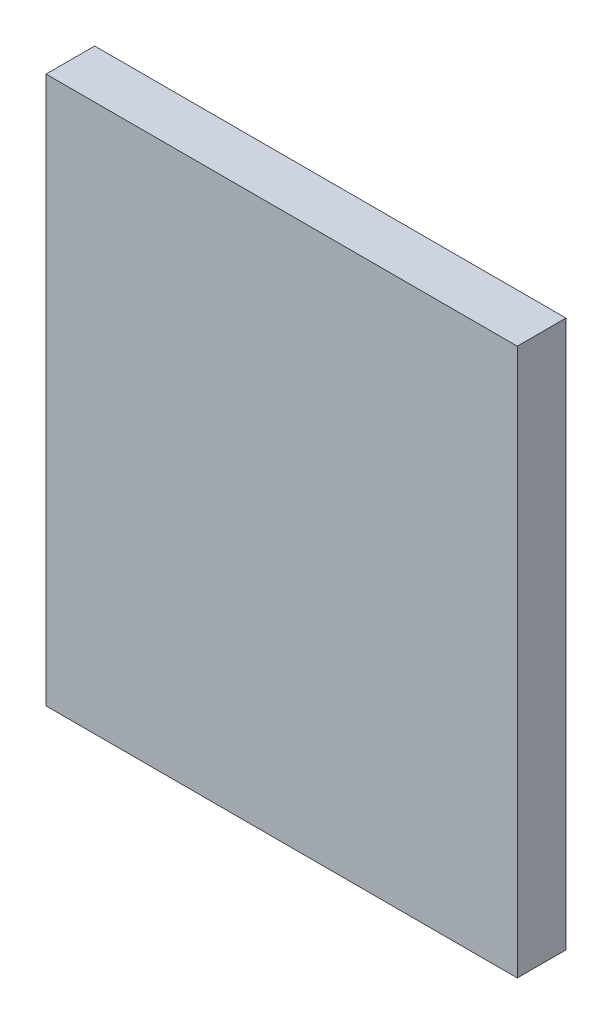
ISO-10303-21;
HEADER;
FILE_DESCRIPTION(('STEP AP214'),'2;1');
FILE_NAME('part.step','',(''),(''),'','','');
FILE_SCHEMA(('AUTOMOTIVE_DESIGN { 1 0 10303 214 1 1 1 1 }'));
ENDSEC;
DATA;
#1=APPLICATION_CONTEXT('core data for automotive mechanical design processes');
#2=APPLICATION_PROTOCOL_DEFINITION('international standard','automotive_design',2000,#1);
#3=PRODUCT_CONTEXT('',#1,'mechanical');
#4=PRODUCT('Part','Part','',(#3));
#5=PRODUCT_RELATED_PRODUCT_CATEGORY('part','',(#4));
#6=PRODUCT_DEFINITION_FORMATION('','',#4);
#7=PRODUCT_DEFINITION_CONTEXT('part definition',#1,'design');
#8=PRODUCT_DEFINITION('design','',#6,#7);
#9=PRODUCT_DEFINITION_SHAPE('','',#8);
#10=(LENGTH_UNIT() NAMED_UNIT(*) SI_UNIT(.MILLI.,.METRE.));
#11=(NAMED_UNIT(*) PLANE_ANGLE_UNIT() SI_UNIT($,.RADIAN.));
#12=(NAMED_UNIT(*) SI_UNIT($,.STERADIAN.) SOLID_ANGLE_UNIT());
#13=UNCERTAINTY_MEASURE_WITH_UNIT(LENGTH_MEASURE(1.E-05),#10,'distance_accuracy_value','');
#14=(GEOMETRIC_REPRESENTATION_CONTEXT(3) GLOBAL_UNCERTAINTY_ASSIGNED_CONTEXT((#13)) GLOBAL_UNIT_ASSIGNED_CONTEXT((#10,
#11,#12)) REPRESENTATION_CONTEXT('',''));
#15=CARTESIAN_POINT('',(0.,0.,0.));
#16=DIRECTION('',(0.,0.,1.));
#17=DIRECTION('',(1.,0.,0.));
#18=AXIS2_PLACEMENT_3D('',#15,#16,#17);
#19=CARTESIAN_POINT('',(0.,0.,1.2));
#20=DIRECTION('',(0.,0.,1.));
#21=DIRECTION('',(1.,0.,0.));
#22=AXIS2_PLACEMENT_3D('',#19,#20,#21);
#23=PLANE('',#22);
#24=DIRECTION('',(1.,0.,0.));
#25=VECTOR('',#24,1.);
#26=CARTESIAN_POINT('',(-5.8136,-6.75,1.2));
#27=LINE('',#26,#25);
#28=CARTESIAN_POINT('',(-5.8136,-6.75,1.2));
#29=VERTEX_POINT('',#28);
#30=CARTESIAN_POINT('',(5.8136,-6.75,1.2));
#31=VERTEX_POINT('',#30);
#32=EDGE_CURVE('E84',#29,#31,#27,.T.);
#33=ORIENTED_EDGE('',*,*,#32,.T.);
#34=DIRECTION('',(0.,1.,0.));
#35=VECTOR('',#34,1.);
#36=CARTESIAN_POINT('',(5.8136,-6.75,1.2));
#37=LINE('',#36,#35);
#38=CARTESIAN_POINT('',(5.8136,6.75,1.2));
#39=VERTEX_POINT('',#38);
#40=EDGE_CURVE('E53',#31,#39,#37,.T.);
#41=ORIENTED_EDGE('',*,*,#40,.T.);
#42=DIRECTION('',(-1.,0.,0.));
#43=VECTOR('',#42,1.);
#44=CARTESIAN_POINT('',(5.8136,6.75,1.2));
#45=LINE('',#44,#43);
#46=CARTESIAN_POINT('',(-5.8136,6.75,1.2));
#47=VERTEX_POINT('',#46);
#48=EDGE_CURVE('E75',#39,#47,#45,.T.);
#49=ORIENTED_EDGE('',*,*,#48,.T.);
#50=DIRECTION('',(0.,-1.,0.));
#51=VECTOR('',#50,1.);
#52=CARTESIAN_POINT('',(-5.8136,6.75,1.2));
#53=LINE('',#52,#51);
#54=EDGE_CURVE('E11',#47,#29,#53,.T.);
#55=ORIENTED_EDGE('',*,*,#54,.T.);
#56=EDGE_LOOP('',(#33,#41,#49,#55));
#57=FACE_BOUND('',#56,.T.);
#58=ADVANCED_FACE('F16',(#57),#23,.T.);
#59=CARTESIAN_POINT('',(0.,0.,0.));
#60=DIRECTION('',(0.,0.,1.));
#61=DIRECTION('',(1.,0.,0.));
#62=AXIS2_PLACEMENT_3D('',#59,#60,#61);
#63=PLANE('',#62);
#64=DIRECTION('',(1.,0.,0.));
#65=VECTOR('',#64,1.);
#66=CARTESIAN_POINT('',(-5.8136,-6.75,0.));
#67=LINE('',#66,#65);
#68=CARTESIAN_POINT('',(-5.8136,-6.75,0.));
#69=VERTEX_POINT('',#68);
#70=CARTESIAN_POINT('',(5.8136,-6.75,0.));
#71=VERTEX_POINT('',#70);
#72=EDGE_CURVE('E96',#69,#71,#67,.T.);
#73=ORIENTED_EDGE('',*,*,#72,.F.);
#74=DIRECTION('',(0.,-1.,0.));
#75=VECTOR('',#74,1.);
#76=CARTESIAN_POINT('',(-5.8136,6.75,0.));
#77=LINE('',#76,#75);
#78=CARTESIAN_POINT('',(-5.8136,6.75,0.));
#79=VERTEX_POINT('',#78);
#80=EDGE_CURVE('E26',#79,#69,#77,.T.);
#81=ORIENTED_EDGE('',*,*,#80,.F.);
#82=DIRECTION('',(-1.,0.,0.));
#83=VECTOR('',#82,1.);
#84=CARTESIAN_POINT('',(5.8136,6.75,0.));
#85=LINE('',#84,#83);
#86=CARTESIAN_POINT('',(5.8136,6.75,0.));
#87=VERTEX_POINT('',#86);
#88=EDGE_CURVE('E87',#87,#79,#85,.T.);
#89=ORIENTED_EDGE('',*,*,#88,.F.);
#90=DIRECTION('',(0.,1.,0.));
#91=VECTOR('',#90,1.);
#92=CARTESIAN_POINT('',(5.8136,-6.75,0.));
#93=LINE('',#92,#91);
#94=EDGE_CURVE('E67',#71,#87,#93,.T.);
#95=ORIENTED_EDGE('',*,*,#94,.F.);
#96=EDGE_LOOP('',(#73,#81,#89,#95));
#97=FACE_BOUND('',#96,.T.);
#98=ADVANCED_FACE('F116',(#97),#63,.F.);
#99=CARTESIAN_POINT('',(-5.8136,6.75,0.));
#100=DIRECTION('',(1.,0.,0.));
#101=DIRECTION('',(0.,1.,0.));
#102=AXIS2_PLACEMENT_3D('',#99,#100,#101);
#103=PLANE('',#102);
#104=DIRECTION('',(0.,0.,1.));
#105=VECTOR('',#104,1.);
#106=CARTESIAN_POINT('',(-5.8136,6.75,0.));
#107=LINE('',#106,#105);
#108=EDGE_CURVE('E79',#79,#47,#107,.T.);
#109=ORIENTED_EDGE('',*,*,#108,.F.);
#110=ORIENTED_EDGE('',*,*,#80,.T.);
#111=DIRECTION('',(0.,0.,1.));
#112=VECTOR('',#111,1.);
#113=CARTESIAN_POINT('',(-5.8136,-6.75,0.));
#114=LINE('',#113,#112);
#115=EDGE_CURVE('E100',#69,#29,#114,.T.);
#116=ORIENTED_EDGE('',*,*,#115,.T.);
#117=ORIENTED_EDGE('',*,*,#54,.F.);
#118=EDGE_LOOP('',(#109,#110,#116,#117));
#119=FACE_BOUND('',#118,.T.);
#120=ADVANCED_FACE('F114',(#119),#103,.F.);
#121=CARTESIAN_POINT('',(5.8136,6.75,0.));
#122=DIRECTION('',(0.,-1.,0.));
#123=DIRECTION('',(0.,0.,-1.));
#124=AXIS2_PLACEMENT_3D('',#121,#122,#123);
#125=PLANE('',#124);
#126=DIRECTION('',(0.,0.,1.));
#127=VECTOR('',#126,1.);
#128=CARTESIAN_POINT('',(5.8136,6.75,0.));
#129=LINE('',#128,#127);
#130=EDGE_CURVE('E78',#87,#39,#129,.T.);
#131=ORIENTED_EDGE('',*,*,#130,.F.);
#132=ORIENTED_EDGE('',*,*,#88,.T.);
#133=ORIENTED_EDGE('',*,*,#108,.T.);
#134=ORIENTED_EDGE('',*,*,#48,.F.);
#135=EDGE_LOOP('',(#131,#132,#133,#134));
#136=FACE_BOUND('',#135,.T.);
#137=ADVANCED_FACE('F76',(#136),#125,.F.);
#138=CARTESIAN_POINT('',(5.8136,-6.75,0.));
#139=DIRECTION('',(-1.,0.,0.));
#140=DIRECTION('',(0.,0.,1.));
#141=AXIS2_PLACEMENT_3D('',#138,#139,#140);
#142=PLANE('',#141);
#143=DIRECTION('',(0.,0.,1.));
#144=VECTOR('',#143,1.);
#145=CARTESIAN_POINT('',(5.8136,-6.75,0.));
#146=LINE('',#145,#144);
#147=EDGE_CURVE('E99',#71,#31,#146,.T.);
#148=ORIENTED_EDGE('',*,*,#147,.F.);
#149=ORIENTED_EDGE('',*,*,#94,.T.);
#150=ORIENTED_EDGE('',*,*,#130,.T.);
#151=ORIENTED_EDGE('',*,*,#40,.F.);
#152=EDGE_LOOP('',(#148,#149,#150,#151));
#153=FACE_BOUND('',#152,.T.);
#154=ADVANCED_FACE('F88',(#153),#142,.F.);
#155=CARTESIAN_POINT('',(-5.8136,-6.75,0.));
#156=DIRECTION('',(0.,1.,0.));
#157=DIRECTION('',(1.,0.,0.));
#158=AXIS2_PLACEMENT_3D('',#155,#156,#157);
#159=PLANE('',#158);
#160=ORIENTED_EDGE('',*,*,#115,.F.);
#161=ORIENTED_EDGE('',*,*,#72,.T.);
#162=ORIENTED_EDGE('',*,*,#147,.T.);
#163=ORIENTED_EDGE('',*,*,#32,.F.);
#164=EDGE_LOOP('',(#160,#161,#162,#163));
#165=FACE_BOUND('',#164,.T.);
#166=ADVANCED_FACE('F18',(#165),#159,.F.);
#167=CLOSED_SHELL('',(#58,#98,#120,#137,#154,#166));
#168=MANIFOLD_SOLID_BREP('B1',#167);
#169=ADVANCED_BREP_SHAPE_REPRESENTATION('',(#18,#168),#14);
#170=SHAPE_DEFINITION_REPRESENTATION(#9,#169);
ENDSEC;
END-ISO-10303-21;
